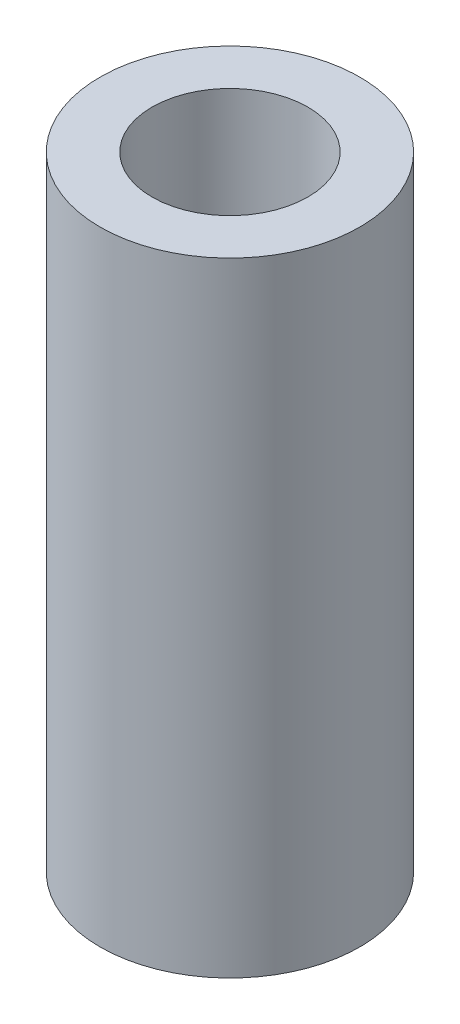
ISO-10303-21;
HEADER;
FILE_DESCRIPTION(('STEP AP214'),'2;1');
FILE_NAME('part.step','',(''),(''),'','','');
FILE_SCHEMA(('AUTOMOTIVE_DESIGN { 1 0 10303 214 1 1 1 1 }'));
ENDSEC;
DATA;
#1=APPLICATION_CONTEXT('core data for automotive mechanical design processes');
#2=APPLICATION_PROTOCOL_DEFINITION('international standard','automotive_design',2000,#1);
#3=PRODUCT_CONTEXT('',#1,'mechanical');
#4=PRODUCT('Part','Part','',(#3));
#5=PRODUCT_RELATED_PRODUCT_CATEGORY('part','',(#4));
#6=PRODUCT_DEFINITION_FORMATION('','',#4);
#7=PRODUCT_DEFINITION_CONTEXT('part definition',#1,'design');
#8=PRODUCT_DEFINITION('design','',#6,#7);
#9=PRODUCT_DEFINITION_SHAPE('','',#8);
#10=(LENGTH_UNIT() NAMED_UNIT(*) SI_UNIT(.MILLI.,.METRE.));
#11=(NAMED_UNIT(*) PLANE_ANGLE_UNIT() SI_UNIT($,.RADIAN.));
#12=(NAMED_UNIT(*) SI_UNIT($,.STERADIAN.) SOLID_ANGLE_UNIT());
#13=UNCERTAINTY_MEASURE_WITH_UNIT(LENGTH_MEASURE(1.E-05),#10,'distance_accuracy_value','');
#14=(GEOMETRIC_REPRESENTATION_CONTEXT(3) GLOBAL_UNCERTAINTY_ASSIGNED_CONTEXT((#13)) GLOBAL_UNIT_ASSIGNED_CONTEXT((#10,
#11,#12)) REPRESENTATION_CONTEXT('',''));
#15=CARTESIAN_POINT('',(0.,0.,0.));
#16=DIRECTION('',(0.,0.,1.));
#17=DIRECTION('',(1.,0.,0.));
#18=AXIS2_PLACEMENT_3D('',#15,#16,#17);
#19=CARTESIAN_POINT('',(0.,12.,0.));
#20=DIRECTION('',(0.,1.,0.));
#21=DIRECTION('',(0.,0.,1.));
#22=AXIS2_PLACEMENT_3D('',#19,#20,#21);
#23=PLANE('',#22);
#24=CARTESIAN_POINT('',(0.,12.,0.));
#25=DIRECTION('',(0.,1.,0.));
#26=DIRECTION('',(0.,0.,1.));
#27=AXIS2_PLACEMENT_3D('',#24,#25,#26);
#28=CIRCLE('',#27,2.5);
#29=CARTESIAN_POINT('',(0.,12.,2.5));
#30=VERTEX_POINT('',#29);
#31=EDGE_CURVE('E10',#30,#30,#28,.T.);
#32=ORIENTED_EDGE('',*,*,#31,.T.);
#33=EDGE_LOOP('',(#32));
#34=FACE_BOUND('',#33,.T.);
#35=CARTESIAN_POINT('',(0.,12.,0.));
#36=DIRECTION('',(0.,1.,0.));
#37=DIRECTION('',(0.,0.,1.));
#38=AXIS2_PLACEMENT_3D('',#35,#36,#37);
#39=CIRCLE('',#38,1.5);
#40=CARTESIAN_POINT('',(0.,12.,1.5));
#41=VERTEX_POINT('',#40);
#42=EDGE_CURVE('E44',#41,#41,#39,.T.);
#43=ORIENTED_EDGE('',*,*,#42,.F.);
#44=EDGE_LOOP('',(#43));
#45=FACE_BOUND('',#44,.T.);
#46=ADVANCED_FACE('F33',(#34,#45),#23,.T.);
#47=CARTESIAN_POINT('',(0.,0.,0.));
#48=DIRECTION('',(0.,1.,0.));
#49=DIRECTION('',(0.,0.,1.));
#50=AXIS2_PLACEMENT_3D('',#47,#48,#49);
#51=PLANE('',#50);
#52=CARTESIAN_POINT('',(0.,0.,0.));
#53=DIRECTION('',(0.,1.,0.));
#54=DIRECTION('',(0.,0.,1.));
#55=AXIS2_PLACEMENT_3D('',#52,#53,#54);
#56=CIRCLE('',#55,2.5);
#57=CARTESIAN_POINT('',(0.,0.,2.5));
#58=VERTEX_POINT('',#57);
#59=EDGE_CURVE('E37',#58,#58,#56,.T.);
#60=ORIENTED_EDGE('',*,*,#59,.F.);
#61=EDGE_LOOP('',(#60));
#62=FACE_BOUND('',#61,.T.);
#63=CARTESIAN_POINT('',(0.,0.,0.));
#64=DIRECTION('',(0.,1.,0.));
#65=DIRECTION('',(0.,0.,1.));
#66=AXIS2_PLACEMENT_3D('',#63,#64,#65);
#67=CIRCLE('',#66,1.5);
#68=CARTESIAN_POINT('',(0.,0.,1.5));
#69=VERTEX_POINT('',#68);
#70=EDGE_CURVE('E46',#69,#69,#67,.T.);
#71=ORIENTED_EDGE('',*,*,#70,.T.);
#72=EDGE_LOOP('',(#71));
#73=FACE_BOUND('',#72,.T.);
#74=ADVANCED_FACE('F56',(#62,#73),#51,.F.);
#75=CARTESIAN_POINT('',(0.,12.,0.));
#76=DIRECTION('',(0.,-1.,0.));
#77=DIRECTION('',(0.,0.,-1.));
#78=AXIS2_PLACEMENT_3D('',#75,#76,#77);
#79=CYLINDRICAL_SURFACE('',#78,2.5);
#80=ORIENTED_EDGE('',*,*,#31,.F.);
#81=EDGE_LOOP('',(#80));
#82=FACE_BOUND('',#81,.T.);
#83=ORIENTED_EDGE('',*,*,#59,.T.);
#84=EDGE_LOOP('',(#83));
#85=FACE_BOUND('',#84,.T.);
#86=ADVANCED_FACE('F35',(#82,#85),#79,.T.);
#87=CARTESIAN_POINT('',(0.,12.,0.));
#88=DIRECTION('',(0.,-1.,0.));
#89=DIRECTION('',(0.,0.,-1.));
#90=AXIS2_PLACEMENT_3D('',#87,#88,#89);
#91=CYLINDRICAL_SURFACE('',#90,1.5);
#92=ORIENTED_EDGE('',*,*,#42,.T.);
#93=EDGE_LOOP('',(#92));
#94=FACE_BOUND('',#93,.T.);
#95=ORIENTED_EDGE('',*,*,#70,.F.);
#96=EDGE_LOOP('',(#95));
#97=FACE_BOUND('',#96,.T.);
#98=ADVANCED_FACE('F52',(#94,#97),#91,.F.);
#99=CLOSED_SHELL('',(#46,#74,#86,#98));
#100=MANIFOLD_SOLID_BREP('B2',#99);
#101=ADVANCED_BREP_SHAPE_REPRESENTATION('',(#18,#100),#14);
#102=SHAPE_DEFINITION_REPRESENTATION(#9,#101);
ENDSEC;
END-ISO-10303-21;
